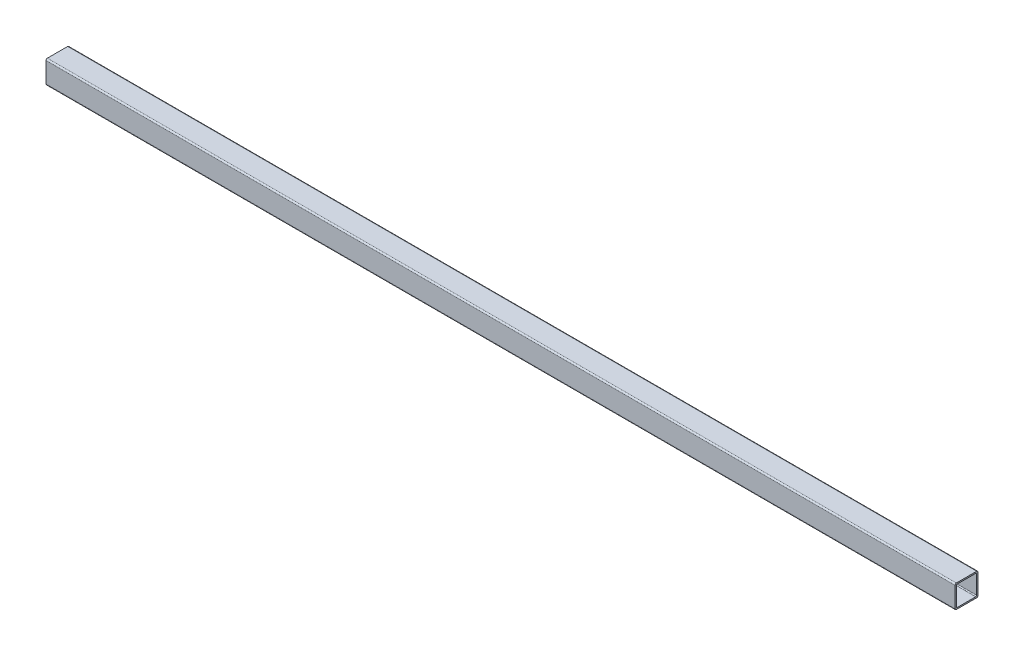
ISO-10303-21;
HEADER;
FILE_DESCRIPTION(('STEP AP214'),'2;1');
FILE_NAME('part.step','',(''),(''),'','','');
FILE_SCHEMA(('AUTOMOTIVE_DESIGN { 1 0 10303 214 1 1 1 1 }'));
ENDSEC;
DATA;
#1=APPLICATION_CONTEXT('core data for automotive mechanical design processes');
#2=APPLICATION_PROTOCOL_DEFINITION('international standard','automotive_design',2000,#1);
#3=PRODUCT_CONTEXT('',#1,'mechanical');
#4=PRODUCT('Part','Part','',(#3));
#5=PRODUCT_RELATED_PRODUCT_CATEGORY('part','',(#4));
#6=PRODUCT_DEFINITION_FORMATION('','',#4);
#7=PRODUCT_DEFINITION_CONTEXT('part definition',#1,'design');
#8=PRODUCT_DEFINITION('design','',#6,#7);
#9=PRODUCT_DEFINITION_SHAPE('','',#8);
#10=(LENGTH_UNIT() NAMED_UNIT(*) SI_UNIT(.MILLI.,.METRE.));
#11=(NAMED_UNIT(*) PLANE_ANGLE_UNIT() SI_UNIT($,.RADIAN.));
#12=(NAMED_UNIT(*) SI_UNIT($,.STERADIAN.) SOLID_ANGLE_UNIT());
#13=UNCERTAINTY_MEASURE_WITH_UNIT(LENGTH_MEASURE(1.E-05),#10,'distance_accuracy_value','');
#14=(GEOMETRIC_REPRESENTATION_CONTEXT(3) GLOBAL_UNCERTAINTY_ASSIGNED_CONTEXT((#13)) GLOBAL_UNIT_ASSIGNED_CONTEXT((#10,
#11,#12)) REPRESENTATION_CONTEXT('',''));
#15=CARTESIAN_POINT('',(0.,0.,0.));
#16=DIRECTION('',(0.,0.,1.));
#17=DIRECTION('',(1.,0.,0.));
#18=AXIS2_PLACEMENT_3D('',#15,#16,#17);
#19=CARTESIAN_POINT('',(958.57864376269,5054.,-8.88178419700125E-13));
#20=DIRECTION('',(0.,0.,1.));
#21=DIRECTION('',(1.,0.,0.));
#22=AXIS2_PLACEMENT_3D('',#19,#20,#21);
#23=PLANE('',#22);
#24=DIRECTION('',(0.,-1.,0.));
#25=VECTOR('',#24,1.);
#26=CARTESIAN_POINT('',(1100.,5054.,-8.88178419700125E-13));
#27=LINE('',#26,#25);
#28=CARTESIAN_POINT('',(1100.,5054.,-8.88178419700125E-13));
#29=VERTEX_POINT('',#28);
#30=CARTESIAN_POINT('',(1100.,4966.,-8.88178419700125E-13));
#31=VERTEX_POINT('',#30);
#32=EDGE_CURVE('E309',#29,#31,#27,.T.);
#33=ORIENTED_EDGE('',*,*,#32,.F.);
#34=DIRECTION('',(1.,0.,0.));
#35=VECTOR('',#34,1.);
#36=CARTESIAN_POINT('',(958.57864376269,5054.,-8.88178419700125E-13));
#37=LINE('',#36,#35);
#38=CARTESIAN_POINT('',(5050.,5054.,-8.88178419700125E-13));
#39=VERTEX_POINT('',#38);
#40=EDGE_CURVE('E53',#29,#39,#37,.T.);
#41=ORIENTED_EDGE('',*,*,#40,.T.);
#42=DIRECTION('',(0.,-1.,0.));
#43=VECTOR('',#42,1.);
#44=CARTESIAN_POINT('',(5050.,5054.,-8.88178419700125E-13));
#45=LINE('',#44,#43);
#46=CARTESIAN_POINT('',(5050.,4966.,-8.88178419700125E-13));
#47=VERTEX_POINT('',#46);
#48=EDGE_CURVE('E204',#39,#47,#45,.T.);
#49=ORIENTED_EDGE('',*,*,#48,.T.);
#50=DIRECTION('',(1.,0.,0.));
#51=VECTOR('',#50,1.);
#52=CARTESIAN_POINT('',(958.57864376269,4966.,-8.88178419700125E-13));
#53=LINE('',#52,#51);
#54=EDGE_CURVE('E207',#31,#47,#53,.T.);
#55=ORIENTED_EDGE('',*,*,#54,.F.);
#56=EDGE_LOOP('',(#33,#41,#49,#55));
#57=FACE_BOUND('',#56,.T.);
#58=ADVANCED_FACE('F38',(#57),#23,.F.);
#59=CARTESIAN_POINT('',(958.57864376269,5054.,5.99999999999934));
#60=DIRECTION('',(1.,0.,0.));
#61=DIRECTION('',(0.,0.,-1.));
#62=AXIS2_PLACEMENT_3D('',#59,#60,#61);
#63=CYLINDRICAL_SURFACE('',#62,6.00000000000023);
#64=CARTESIAN_POINT('',(1100.,5054.,5.99999999999934));
#65=DIRECTION('',(-1.,0.,0.));
#66=DIRECTION('',(0.,0.,1.));
#67=AXIS2_PLACEMENT_3D('',#64,#65,#66);
#68=CIRCLE('',#67,6.00000000000023);
#69=CARTESIAN_POINT('',(1100.,5060.,5.99999999999934));
#70=VERTEX_POINT('',#69);
#71=EDGE_CURVE('E245',#70,#29,#68,.T.);
#72=ORIENTED_EDGE('',*,*,#71,.F.);
#73=DIRECTION('',(1.,0.,0.));
#74=VECTOR('',#73,1.);
#75=CARTESIAN_POINT('',(958.57864376269,5060.,5.99999999999934));
#76=LINE('',#75,#74);
#77=CARTESIAN_POINT('',(5050.,5060.,5.99999999999934));
#78=VERTEX_POINT('',#77);
#79=EDGE_CURVE('E210',#70,#78,#76,.T.);
#80=ORIENTED_EDGE('',*,*,#79,.T.);
#81=CARTESIAN_POINT('',(5050.,5054.,5.99999999999934));
#82=DIRECTION('',(-1.,0.,0.));
#83=DIRECTION('',(0.,0.,1.));
#84=AXIS2_PLACEMENT_3D('',#81,#82,#83);
#85=CIRCLE('',#84,6.00000000000023);
#86=EDGE_CURVE('E202',#78,#39,#85,.T.);
#87=ORIENTED_EDGE('',*,*,#86,.T.);
#88=ORIENTED_EDGE('',*,*,#40,.F.);
#89=EDGE_LOOP('',(#72,#80,#87,#88));
#90=FACE_BOUND('',#89,.T.);
#91=ADVANCED_FACE('F242',(#90),#63,.T.);
#92=CARTESIAN_POINT('',(958.57864376269,5060.,5.99999999999934));
#93=DIRECTION('',(0.,-1.,0.));
#94=DIRECTION('',(0.,0.,-1.));
#95=AXIS2_PLACEMENT_3D('',#92,#93,#94);
#96=PLANE('',#95);
#97=DIRECTION('',(0.,0.,-1.));
#98=VECTOR('',#97,1.);
#99=CARTESIAN_POINT('',(1100.,5060.,5.99999999999934));
#100=LINE('',#99,#98);
#101=CARTESIAN_POINT('',(1100.,5060.,93.9999999999985));
#102=VERTEX_POINT('',#101);
#103=EDGE_CURVE('E250',#102,#70,#100,.T.);
#104=ORIENTED_EDGE('',*,*,#103,.F.);
#105=DIRECTION('',(1.,0.,0.));
#106=VECTOR('',#105,1.);
#107=CARTESIAN_POINT('',(958.57864376269,5060.,93.9999999999985));
#108=LINE('',#107,#106);
#109=CARTESIAN_POINT('',(5050.,5060.,93.9999999999985));
#110=VERTEX_POINT('',#109);
#111=EDGE_CURVE('E212',#102,#110,#108,.T.);
#112=ORIENTED_EDGE('',*,*,#111,.T.);
#113=DIRECTION('',(0.,0.,-1.));
#114=VECTOR('',#113,1.);
#115=CARTESIAN_POINT('',(5050.,5060.,5.99999999999934));
#116=LINE('',#115,#114);
#117=EDGE_CURVE('E199',#110,#78,#116,.T.);
#118=ORIENTED_EDGE('',*,*,#117,.T.);
#119=ORIENTED_EDGE('',*,*,#79,.F.);
#120=EDGE_LOOP('',(#104,#112,#118,#119));
#121=FACE_BOUND('',#120,.T.);
#122=ADVANCED_FACE('F248',(#121),#96,.F.);
#123=CARTESIAN_POINT('',(958.57864376269,5054.,93.9999999999985));
#124=DIRECTION('',(1.,0.,0.));
#125=DIRECTION('',(0.,0.,-1.));
#126=AXIS2_PLACEMENT_3D('',#123,#124,#125);
#127=CYLINDRICAL_SURFACE('',#126,6.00000000000023);
#128=CARTESIAN_POINT('',(1100.,5054.,93.9999999999985));
#129=DIRECTION('',(-1.,0.,0.));
#130=DIRECTION('',(0.,0.,1.));
#131=AXIS2_PLACEMENT_3D('',#128,#129,#130);
#132=CIRCLE('',#131,6.00000000000023);
#133=CARTESIAN_POINT('',(1100.,5054.,99.9999999999987));
#134=VERTEX_POINT('',#133);
#135=EDGE_CURVE('E313',#134,#102,#132,.T.);
#136=ORIENTED_EDGE('',*,*,#135,.F.);
#137=DIRECTION('',(1.,0.,0.));
#138=VECTOR('',#137,1.);
#139=CARTESIAN_POINT('',(958.57864376269,5054.,99.9999999999987));
#140=LINE('',#139,#138);
#141=CARTESIAN_POINT('',(5050.,5054.,99.9999999999987));
#142=VERTEX_POINT('',#141);
#143=EDGE_CURVE('E214',#134,#142,#140,.T.);
#144=ORIENTED_EDGE('',*,*,#143,.T.);
#145=CARTESIAN_POINT('',(5050.,5054.,93.9999999999985));
#146=DIRECTION('',(-1.,0.,0.));
#147=DIRECTION('',(0.,0.,-1.));
#148=AXIS2_PLACEMENT_3D('',#145,#146,#147);
#149=CIRCLE('',#148,6.00000000000023);
#150=EDGE_CURVE('E196',#142,#110,#149,.T.);
#151=ORIENTED_EDGE('',*,*,#150,.T.);
#152=ORIENTED_EDGE('',*,*,#111,.F.);
#153=EDGE_LOOP('',(#136,#144,#151,#152));
#154=FACE_BOUND('',#153,.T.);
#155=ADVANCED_FACE('F253',(#154),#127,.T.);
#156=CARTESIAN_POINT('',(958.57864376269,5054.,99.9999999999987));
#157=DIRECTION('',(0.,0.,-1.));
#158=DIRECTION('',(-1.,0.,0.));
#159=AXIS2_PLACEMENT_3D('',#156,#157,#158);
#160=PLANE('',#159);
#161=DIRECTION('',(0.,1.,0.));
#162=VECTOR('',#161,1.);
#163=CARTESIAN_POINT('',(1100.,5054.,99.9999999999987));
#164=LINE('',#163,#162);
#165=CARTESIAN_POINT('',(1100.,4966.,99.9999999999987));
#166=VERTEX_POINT('',#165);
#167=EDGE_CURVE('E259',#166,#134,#164,.T.);
#168=ORIENTED_EDGE('',*,*,#167,.F.);
#169=DIRECTION('',(1.,0.,0.));
#170=VECTOR('',#169,1.);
#171=CARTESIAN_POINT('',(958.57864376269,4966.,99.9999999999987));
#172=LINE('',#171,#170);
#173=CARTESIAN_POINT('',(5050.,4966.,99.9999999999987));
#174=VERTEX_POINT('',#173);
#175=EDGE_CURVE('E216',#166,#174,#172,.T.);
#176=ORIENTED_EDGE('',*,*,#175,.T.);
#177=DIRECTION('',(0.,1.,0.));
#178=VECTOR('',#177,1.);
#179=CARTESIAN_POINT('',(5050.,5054.,99.9999999999987));
#180=LINE('',#179,#178);
#181=EDGE_CURVE('E193',#174,#142,#180,.T.);
#182=ORIENTED_EDGE('',*,*,#181,.T.);
#183=ORIENTED_EDGE('',*,*,#143,.F.);
#184=EDGE_LOOP('',(#168,#176,#182,#183));
#185=FACE_BOUND('',#184,.T.);
#186=ADVANCED_FACE('F256',(#185),#160,.F.);
#187=CARTESIAN_POINT('',(958.57864376269,4966.,93.9999999999985));
#188=DIRECTION('',(1.,0.,0.));
#189=DIRECTION('',(0.,0.,-1.));
#190=AXIS2_PLACEMENT_3D('',#187,#188,#189);
#191=CYLINDRICAL_SURFACE('',#190,6.00000000000023);
#192=CARTESIAN_POINT('',(1100.,4966.,93.9999999999985));
#193=DIRECTION('',(-1.,0.,0.));
#194=DIRECTION('',(0.,0.,1.));
#195=AXIS2_PLACEMENT_3D('',#192,#193,#194);
#196=CIRCLE('',#195,6.00000000000023);
#197=CARTESIAN_POINT('',(1100.,4960.,93.9999999999985));
#198=VERTEX_POINT('',#197);
#199=EDGE_CURVE('E263',#198,#166,#196,.T.);
#200=ORIENTED_EDGE('',*,*,#199,.F.);
#201=DIRECTION('',(1.,0.,0.));
#202=VECTOR('',#201,1.);
#203=CARTESIAN_POINT('',(958.57864376269,4960.,93.9999999999985));
#204=LINE('',#203,#202);
#205=CARTESIAN_POINT('',(5050.,4960.,93.9999999999985));
#206=VERTEX_POINT('',#205);
#207=EDGE_CURVE('E218',#198,#206,#204,.T.);
#208=ORIENTED_EDGE('',*,*,#207,.T.);
#209=CARTESIAN_POINT('',(5050.,4966.,93.9999999999985));
#210=DIRECTION('',(-1.,0.,0.));
#211=DIRECTION('',(0.,0.,1.));
#212=AXIS2_PLACEMENT_3D('',#209,#210,#211);
#213=CIRCLE('',#212,6.00000000000023);
#214=EDGE_CURVE('E190',#206,#174,#213,.T.);
#215=ORIENTED_EDGE('',*,*,#214,.T.);
#216=ORIENTED_EDGE('',*,*,#175,.F.);
#217=EDGE_LOOP('',(#200,#208,#215,#216));
#218=FACE_BOUND('',#217,.T.);
#219=ADVANCED_FACE('F262',(#218),#191,.T.);
#220=CARTESIAN_POINT('',(958.57864376269,4960.,5.99999999999934));
#221=DIRECTION('',(0.,1.,0.));
#222=DIRECTION('',(0.,0.,1.));
#223=AXIS2_PLACEMENT_3D('',#220,#221,#222);
#224=PLANE('',#223);
#225=DIRECTION('',(0.,0.,1.));
#226=VECTOR('',#225,1.);
#227=CARTESIAN_POINT('',(1100.,4960.,5.99999999999934));
#228=LINE('',#227,#226);
#229=CARTESIAN_POINT('',(1100.,4960.,5.99999999999934));
#230=VERTEX_POINT('',#229);
#231=EDGE_CURVE('E226',#230,#198,#228,.T.);
#232=ORIENTED_EDGE('',*,*,#231,.F.);
#233=DIRECTION('',(1.,0.,0.));
#234=VECTOR('',#233,1.);
#235=CARTESIAN_POINT('',(958.57864376269,4960.,5.99999999999934));
#236=LINE('',#235,#234);
#237=CARTESIAN_POINT('',(5050.,4960.,5.99999999999934));
#238=VERTEX_POINT('',#237);
#239=EDGE_CURVE('E46',#230,#238,#236,.T.);
#240=ORIENTED_EDGE('',*,*,#239,.T.);
#241=DIRECTION('',(0.,0.,1.));
#242=VECTOR('',#241,1.);
#243=CARTESIAN_POINT('',(5050.,4960.,5.99999999999934));
#244=LINE('',#243,#242);
#245=EDGE_CURVE('E187',#238,#206,#244,.T.);
#246=ORIENTED_EDGE('',*,*,#245,.T.);
#247=ORIENTED_EDGE('',*,*,#207,.F.);
#248=EDGE_LOOP('',(#232,#240,#246,#247));
#249=FACE_BOUND('',#248,.T.);
#250=ADVANCED_FACE('F222',(#249),#224,.F.);
#251=CARTESIAN_POINT('',(958.57864376269,4966.,5.99999999999934));
#252=DIRECTION('',(1.,0.,0.));
#253=DIRECTION('',(0.,0.,-1.));
#254=AXIS2_PLACEMENT_3D('',#251,#252,#253);
#255=CYLINDRICAL_SURFACE('',#254,6.00000000000023);
#256=CARTESIAN_POINT('',(1100.,4966.,5.99999999999934));
#257=DIRECTION('',(-1.,0.,0.));
#258=DIRECTION('',(0.,0.,1.));
#259=AXIS2_PLACEMENT_3D('',#256,#257,#258);
#260=CIRCLE('',#259,6.00000000000023);
#261=EDGE_CURVE('E236',#31,#230,#260,.T.);
#262=ORIENTED_EDGE('',*,*,#261,.F.);
#263=ORIENTED_EDGE('',*,*,#54,.T.);
#264=CARTESIAN_POINT('',(5050.,4966.,5.99999999999934));
#265=DIRECTION('',(-1.,0.,0.));
#266=DIRECTION('',(0.,0.,1.));
#267=AXIS2_PLACEMENT_3D('',#264,#265,#266);
#268=CIRCLE('',#267,6.00000000000023);
#269=EDGE_CURVE('E184',#47,#238,#268,.T.);
#270=ORIENTED_EDGE('',*,*,#269,.T.);
#271=ORIENTED_EDGE('',*,*,#239,.F.);
#272=EDGE_LOOP('',(#262,#263,#270,#271));
#273=FACE_BOUND('',#272,.T.);
#274=ADVANCED_FACE('F40',(#273),#255,.T.);
#275=CARTESIAN_POINT('',(5050.,4966.,5.99999999999934));
#276=DIRECTION('',(-1.,0.,0.));
#277=DIRECTION('',(0.,0.,1.));
#278=AXIS2_PLACEMENT_3D('',#275,#276,#277);
#279=PLANE('',#278);
#280=ORIENTED_EDGE('',*,*,#269,.F.);
#281=ORIENTED_EDGE('',*,*,#48,.F.);
#282=ORIENTED_EDGE('',*,*,#86,.F.);
#283=ORIENTED_EDGE('',*,*,#117,.F.);
#284=ORIENTED_EDGE('',*,*,#150,.F.);
#285=ORIENTED_EDGE('',*,*,#181,.F.);
#286=ORIENTED_EDGE('',*,*,#214,.F.);
#287=ORIENTED_EDGE('',*,*,#245,.F.);
#288=EDGE_LOOP('',(#280,#281,#282,#283,#284,#285,#286,#287));
#289=FACE_BOUND('',#288,.T.);
#290=CARTESIAN_POINT('',(5050.,4970.,9.99999999999801));
#291=DIRECTION('',(-1.,0.,0.));
#292=DIRECTION('',(0.,0.,1.));
#293=AXIS2_PLACEMENT_3D('',#290,#291,#292);
#294=CIRCLE('',#293,3.99999999999956);
#295=CARTESIAN_POINT('',(5050.,4970.,5.99999999999845));
#296=VERTEX_POINT('',#295);
#297=CARTESIAN_POINT('',(5050.,4966.,9.99999999999801));
#298=VERTEX_POINT('',#297);
#299=EDGE_CURVE('E265',#296,#298,#294,.T.);
#300=ORIENTED_EDGE('',*,*,#299,.T.);
#301=DIRECTION('',(0.,0.,1.));
#302=VECTOR('',#301,1.);
#303=CARTESIAN_POINT('',(5050.,4966.,9.99999999999801));
#304=LINE('',#303,#302);
#305=CARTESIAN_POINT('',(5050.,4966.,89.9999999999999));
#306=VERTEX_POINT('',#305);
#307=EDGE_CURVE('E272',#298,#306,#304,.T.);
#308=ORIENTED_EDGE('',*,*,#307,.T.);
#309=CARTESIAN_POINT('',(5050.,4970.,89.9999999999999));
#310=DIRECTION('',(-1.,0.,0.));
#311=DIRECTION('',(0.,0.,1.));
#312=AXIS2_PLACEMENT_3D('',#309,#310,#311);
#313=CIRCLE('',#312,3.99999999999956);
#314=CARTESIAN_POINT('',(5050.,4970.,93.9999999999994));
#315=VERTEX_POINT('',#314);
#316=EDGE_CURVE('E275',#306,#315,#313,.T.);
#317=ORIENTED_EDGE('',*,*,#316,.T.);
#318=DIRECTION('',(0.,1.,0.));
#319=VECTOR('',#318,1.);
#320=CARTESIAN_POINT('',(5050.,5050.,93.9999999999994));
#321=LINE('',#320,#319);
#322=CARTESIAN_POINT('',(5050.,5050.,93.9999999999999));
#323=VERTEX_POINT('',#322);
#324=EDGE_CURVE('E278',#315,#323,#321,.T.);
#325=ORIENTED_EDGE('',*,*,#324,.T.);
#326=CARTESIAN_POINT('',(5050.,5050.,89.9999999999999));
#327=DIRECTION('',(-1.,0.,0.));
#328=DIRECTION('',(0.,0.,-1.));
#329=AXIS2_PLACEMENT_3D('',#326,#327,#328);
#330=CIRCLE('',#329,4.);
#331=CARTESIAN_POINT('',(5050.,5054.,89.9999999999999));
#332=VERTEX_POINT('',#331);
#333=EDGE_CURVE('E281',#323,#332,#330,.T.);
#334=ORIENTED_EDGE('',*,*,#333,.T.);
#335=DIRECTION('',(0.,0.,-1.));
#336=VECTOR('',#335,1.);
#337=CARTESIAN_POINT('',(5050.,5054.,9.99999999999801));
#338=LINE('',#337,#336);
#339=CARTESIAN_POINT('',(5050.,5054.,9.99999999999801));
#340=VERTEX_POINT('',#339);
#341=EDGE_CURVE('E284',#332,#340,#338,.T.);
#342=ORIENTED_EDGE('',*,*,#341,.T.);
#343=CARTESIAN_POINT('',(5050.,5050.,9.99999999999801));
#344=DIRECTION('',(-1.,0.,0.));
#345=DIRECTION('',(0.,0.,1.));
#346=AXIS2_PLACEMENT_3D('',#343,#344,#345);
#347=CIRCLE('',#346,4.);
#348=CARTESIAN_POINT('',(5050.,5050.,5.99999999999845));
#349=VERTEX_POINT('',#348);
#350=EDGE_CURVE('E287',#340,#349,#347,.T.);
#351=ORIENTED_EDGE('',*,*,#350,.T.);
#352=DIRECTION('',(0.,-1.,0.));
#353=VECTOR('',#352,1.);
#354=CARTESIAN_POINT('',(5050.,5050.,5.99999999999845));
#355=LINE('',#354,#353);
#356=EDGE_CURVE('E166',#349,#296,#355,.T.);
#357=ORIENTED_EDGE('',*,*,#356,.T.);
#358=EDGE_LOOP('',(#300,#308,#317,#325,#334,#342,#351,#357));
#359=FACE_BOUND('',#358,.T.);
#360=ADVANCED_FACE('F232',(#289,#359),#279,.F.);
#361=CARTESIAN_POINT('',(958.57864376269,5050.,5.99999999999845));
#362=DIRECTION('',(0.,0.,1.));
#363=DIRECTION('',(1.,0.,0.));
#364=AXIS2_PLACEMENT_3D('',#361,#362,#363);
#365=PLANE('',#364);
#366=DIRECTION('',(1.,0.,0.));
#367=VECTOR('',#366,1.);
#368=CARTESIAN_POINT('',(958.57864376269,5050.,5.99999999999845));
#369=LINE('',#368,#367);
#370=CARTESIAN_POINT('',(1100.,5050.,5.99999999999845));
#371=VERTEX_POINT('',#370);
#372=EDGE_CURVE('E158',#371,#349,#369,.T.);
#373=ORIENTED_EDGE('',*,*,#372,.F.);
#374=DIRECTION('',(0.,-1.,0.));
#375=VECTOR('',#374,1.);
#376=CARTESIAN_POINT('',(1100.,5050.,5.99999999999845));
#377=LINE('',#376,#375);
#378=CARTESIAN_POINT('',(1100.,4970.,5.99999999999845));
#379=VERTEX_POINT('',#378);
#380=EDGE_CURVE('E11',#371,#379,#377,.T.);
#381=ORIENTED_EDGE('',*,*,#380,.T.);
#382=DIRECTION('',(1.,0.,0.));
#383=VECTOR('',#382,1.);
#384=CARTESIAN_POINT('',(958.57864376269,4970.,5.99999999999845));
#385=LINE('',#384,#383);
#386=EDGE_CURVE('E168',#379,#296,#385,.T.);
#387=ORIENTED_EDGE('',*,*,#386,.T.);
#388=ORIENTED_EDGE('',*,*,#356,.F.);
#389=EDGE_LOOP('',(#373,#381,#387,#388));
#390=FACE_BOUND('',#389,.T.);
#391=ADVANCED_FACE('F164',(#390),#365,.T.);
#392=CARTESIAN_POINT('',(958.57864376269,5050.,9.99999999999801));
#393=DIRECTION('',(1.,0.,0.));
#394=DIRECTION('',(0.,0.,-1.));
#395=AXIS2_PLACEMENT_3D('',#392,#393,#394);
#396=CYLINDRICAL_SURFACE('',#395,4.);
#397=DIRECTION('',(1.,0.,0.));
#398=VECTOR('',#397,1.);
#399=CARTESIAN_POINT('',(958.57864376269,5054.,9.99999999999801));
#400=LINE('',#399,#398);
#401=CARTESIAN_POINT('',(1100.,5054.,9.99999999999801));
#402=VERTEX_POINT('',#401);
#403=EDGE_CURVE('E160',#402,#340,#400,.T.);
#404=ORIENTED_EDGE('',*,*,#403,.F.);
#405=CARTESIAN_POINT('',(1100.,5050.,9.99999999999801));
#406=DIRECTION('',(-1.,0.,0.));
#407=DIRECTION('',(0.,0.,1.));
#408=AXIS2_PLACEMENT_3D('',#405,#406,#407);
#409=CIRCLE('',#408,4.);
#410=EDGE_CURVE('E151',#402,#371,#409,.T.);
#411=ORIENTED_EDGE('',*,*,#410,.T.);
#412=ORIENTED_EDGE('',*,*,#372,.T.);
#413=ORIENTED_EDGE('',*,*,#350,.F.);
#414=EDGE_LOOP('',(#404,#411,#412,#413));
#415=FACE_BOUND('',#414,.T.);
#416=ADVANCED_FACE('F156',(#415),#396,.F.);
#417=CARTESIAN_POINT('',(958.57864376269,5054.,9.99999999999801));
#418=DIRECTION('',(0.,-1.,0.));
#419=DIRECTION('',(0.,0.,-1.));
#420=AXIS2_PLACEMENT_3D('',#417,#418,#419);
#421=PLANE('',#420);
#422=DIRECTION('',(1.,0.,0.));
#423=VECTOR('',#422,1.);
#424=CARTESIAN_POINT('',(958.57864376269,5054.,89.9999999999999));
#425=LINE('',#424,#423);
#426=CARTESIAN_POINT('',(1100.,5054.,89.9999999999999));
#427=VERTEX_POINT('',#426);
#428=EDGE_CURVE('E170',#427,#332,#425,.T.);
#429=ORIENTED_EDGE('',*,*,#428,.F.);
#430=DIRECTION('',(0.,0.,-1.));
#431=VECTOR('',#430,1.);
#432=CARTESIAN_POINT('',(1100.,5054.,9.99999999999801));
#433=LINE('',#432,#431);
#434=EDGE_CURVE('E162',#427,#402,#433,.T.);
#435=ORIENTED_EDGE('',*,*,#434,.T.);
#436=ORIENTED_EDGE('',*,*,#403,.T.);
#437=ORIENTED_EDGE('',*,*,#341,.F.);
#438=EDGE_LOOP('',(#429,#435,#436,#437));
#439=FACE_BOUND('',#438,.T.);
#440=ADVANCED_FACE('F293',(#439),#421,.T.);
#441=CARTESIAN_POINT('',(958.57864376269,5050.,89.9999999999999));
#442=DIRECTION('',(1.,0.,0.));
#443=DIRECTION('',(0.,0.,-1.));
#444=AXIS2_PLACEMENT_3D('',#441,#442,#443);
#445=CYLINDRICAL_SURFACE('',#444,4.);
#446=DIRECTION('',(1.,0.,0.));
#447=VECTOR('',#446,1.);
#448=CARTESIAN_POINT('',(958.57864376269,5050.,93.9999999999999));
#449=LINE('',#448,#447);
#450=CARTESIAN_POINT('',(1100.,5050.,93.9999999999999));
#451=VERTEX_POINT('',#450);
#452=EDGE_CURVE('E176',#451,#323,#449,.T.);
#453=ORIENTED_EDGE('',*,*,#452,.F.);
#454=CARTESIAN_POINT('',(1100.,5050.,89.9999999999999));
#455=DIRECTION('',(-1.,0.,0.));
#456=DIRECTION('',(0.,0.,1.));
#457=AXIS2_PLACEMENT_3D('',#454,#455,#456);
#458=CIRCLE('',#457,4.);
#459=EDGE_CURVE('E295',#451,#427,#458,.T.);
#460=ORIENTED_EDGE('',*,*,#459,.T.);
#461=ORIENTED_EDGE('',*,*,#428,.T.);
#462=ORIENTED_EDGE('',*,*,#333,.F.);
#463=EDGE_LOOP('',(#453,#460,#461,#462));
#464=FACE_BOUND('',#463,.T.);
#465=ADVANCED_FACE('F330',(#464),#445,.F.);
#466=CARTESIAN_POINT('',(958.57864376269,5050.,93.9999999999994));
#467=DIRECTION('',(0.,0.,-1.));
#468=DIRECTION('',(-1.,0.,0.));
#469=AXIS2_PLACEMENT_3D('',#466,#467,#468);
#470=PLANE('',#469);
#471=DIRECTION('',(1.,0.,0.));
#472=VECTOR('',#471,1.);
#473=CARTESIAN_POINT('',(958.57864376269,4970.,93.9999999999994));
#474=LINE('',#473,#472);
#475=CARTESIAN_POINT('',(1100.,4970.,93.9999999999994));
#476=VERTEX_POINT('',#475);
#477=EDGE_CURVE('E178',#476,#315,#474,.T.);
#478=ORIENTED_EDGE('',*,*,#477,.F.);
#479=DIRECTION('',(0.,1.,0.));
#480=VECTOR('',#479,1.);
#481=CARTESIAN_POINT('',(1100.,5050.,93.9999999999994));
#482=LINE('',#481,#480);
#483=EDGE_CURVE('E297',#476,#451,#482,.T.);
#484=ORIENTED_EDGE('',*,*,#483,.T.);
#485=ORIENTED_EDGE('',*,*,#452,.T.);
#486=ORIENTED_EDGE('',*,*,#324,.F.);
#487=EDGE_LOOP('',(#478,#484,#485,#486));
#488=FACE_BOUND('',#487,.T.);
#489=ADVANCED_FACE('F327',(#488),#470,.T.);
#490=CARTESIAN_POINT('',(958.57864376269,4970.,89.9999999999999));
#491=DIRECTION('',(1.,0.,0.));
#492=DIRECTION('',(0.,0.,-1.));
#493=AXIS2_PLACEMENT_3D('',#490,#491,#492);
#494=CYLINDRICAL_SURFACE('',#493,3.99999999999956);
#495=DIRECTION('',(1.,0.,0.));
#496=VECTOR('',#495,1.);
#497=CARTESIAN_POINT('',(958.57864376269,4966.,89.9999999999999));
#498=LINE('',#497,#496);
#499=CARTESIAN_POINT('',(1100.,4966.,89.9999999999999));
#500=VERTEX_POINT('',#499);
#501=EDGE_CURVE('E180',#500,#306,#498,.T.);
#502=ORIENTED_EDGE('',*,*,#501,.F.);
#503=CARTESIAN_POINT('',(1100.,4970.,89.9999999999999));
#504=DIRECTION('',(-1.,0.,0.));
#505=DIRECTION('',(0.,0.,1.));
#506=AXIS2_PLACEMENT_3D('',#503,#504,#505);
#507=CIRCLE('',#506,3.99999999999956);
#508=EDGE_CURVE('E302',#500,#476,#507,.T.);
#509=ORIENTED_EDGE('',*,*,#508,.T.);
#510=ORIENTED_EDGE('',*,*,#477,.T.);
#511=ORIENTED_EDGE('',*,*,#316,.F.);
#512=EDGE_LOOP('',(#502,#509,#510,#511));
#513=FACE_BOUND('',#512,.T.);
#514=ADVANCED_FACE('F324',(#513),#494,.F.);
#515=CARTESIAN_POINT('',(958.57864376269,4966.,9.99999999999801));
#516=DIRECTION('',(0.,1.,0.));
#517=DIRECTION('',(0.,0.,1.));
#518=AXIS2_PLACEMENT_3D('',#515,#516,#517);
#519=PLANE('',#518);
#520=DIRECTION('',(1.,0.,0.));
#521=VECTOR('',#520,1.);
#522=CARTESIAN_POINT('',(958.57864376269,4966.,9.99999999999801));
#523=LINE('',#522,#521);
#524=CARTESIAN_POINT('',(1100.,4966.,9.99999999999801));
#525=VERTEX_POINT('',#524);
#526=EDGE_CURVE('E182',#525,#298,#523,.T.);
#527=ORIENTED_EDGE('',*,*,#526,.F.);
#528=DIRECTION('',(0.,0.,1.));
#529=VECTOR('',#528,1.);
#530=CARTESIAN_POINT('',(1100.,4966.,9.99999999999801));
#531=LINE('',#530,#529);
#532=EDGE_CURVE('E305',#525,#500,#531,.T.);
#533=ORIENTED_EDGE('',*,*,#532,.T.);
#534=ORIENTED_EDGE('',*,*,#501,.T.);
#535=ORIENTED_EDGE('',*,*,#307,.F.);
#536=EDGE_LOOP('',(#527,#533,#534,#535));
#537=FACE_BOUND('',#536,.T.);
#538=ADVANCED_FACE('F319',(#537),#519,.T.);
#539=CARTESIAN_POINT('',(958.57864376269,4970.,9.99999999999801));
#540=DIRECTION('',(1.,0.,0.));
#541=DIRECTION('',(0.,0.,-1.));
#542=AXIS2_PLACEMENT_3D('',#539,#540,#541);
#543=CYLINDRICAL_SURFACE('',#542,3.99999999999956);
#544=ORIENTED_EDGE('',*,*,#386,.F.);
#545=CARTESIAN_POINT('',(1100.,4970.,9.99999999999801));
#546=DIRECTION('',(-1.,0.,0.));
#547=DIRECTION('',(0.,0.,1.));
#548=AXIS2_PLACEMENT_3D('',#545,#546,#547);
#549=CIRCLE('',#548,3.99999999999956);
#550=EDGE_CURVE('E61',#379,#525,#549,.T.);
#551=ORIENTED_EDGE('',*,*,#550,.T.);
#552=ORIENTED_EDGE('',*,*,#526,.T.);
#553=ORIENTED_EDGE('',*,*,#299,.F.);
#554=EDGE_LOOP('',(#544,#551,#552,#553));
#555=FACE_BOUND('',#554,.T.);
#556=ADVANCED_FACE('F315',(#555),#543,.F.);
#557=CARTESIAN_POINT('',(1100.,5060.,6.00000000000001));
#558=DIRECTION('',(-1.,0.,0.));
#559=DIRECTION('',(0.,0.,1.));
#560=AXIS2_PLACEMENT_3D('',#557,#558,#559);
#561=PLANE('',#560);
#562=ORIENTED_EDGE('',*,*,#550,.F.);
#563=ORIENTED_EDGE('',*,*,#380,.F.);
#564=ORIENTED_EDGE('',*,*,#410,.F.);
#565=ORIENTED_EDGE('',*,*,#434,.F.);
#566=ORIENTED_EDGE('',*,*,#459,.F.);
#567=ORIENTED_EDGE('',*,*,#483,.F.);
#568=ORIENTED_EDGE('',*,*,#508,.F.);
#569=ORIENTED_EDGE('',*,*,#532,.F.);
#570=EDGE_LOOP('',(#562,#563,#564,#565,#566,#567,#568,#569));
#571=FACE_BOUND('',#570,.T.);
#572=ORIENTED_EDGE('',*,*,#32,.T.);
#573=ORIENTED_EDGE('',*,*,#261,.T.);
#574=ORIENTED_EDGE('',*,*,#231,.T.);
#575=ORIENTED_EDGE('',*,*,#199,.T.);
#576=ORIENTED_EDGE('',*,*,#167,.T.);
#577=ORIENTED_EDGE('',*,*,#135,.T.);
#578=ORIENTED_EDGE('',*,*,#103,.T.);
#579=ORIENTED_EDGE('',*,*,#71,.T.);
#580=EDGE_LOOP('',(#572,#573,#574,#575,#576,#577,#578,#579));
#581=FACE_BOUND('',#580,.T.);
#582=ADVANCED_FACE('F149',(#571,#581),#561,.T.);
#583=CLOSED_SHELL('',(#58,#91,#122,#155,#186,#219,#250,#274,#360,#391,#416,#440,#465,#489,#514,
#538,#556,#582));
#584=MANIFOLD_SOLID_BREP('B2',#583);
#585=ADVANCED_BREP_SHAPE_REPRESENTATION('',(#18,#584),#14);
#586=SHAPE_DEFINITION_REPRESENTATION(#9,#585);
ENDSEC;
END-ISO-10303-21;
